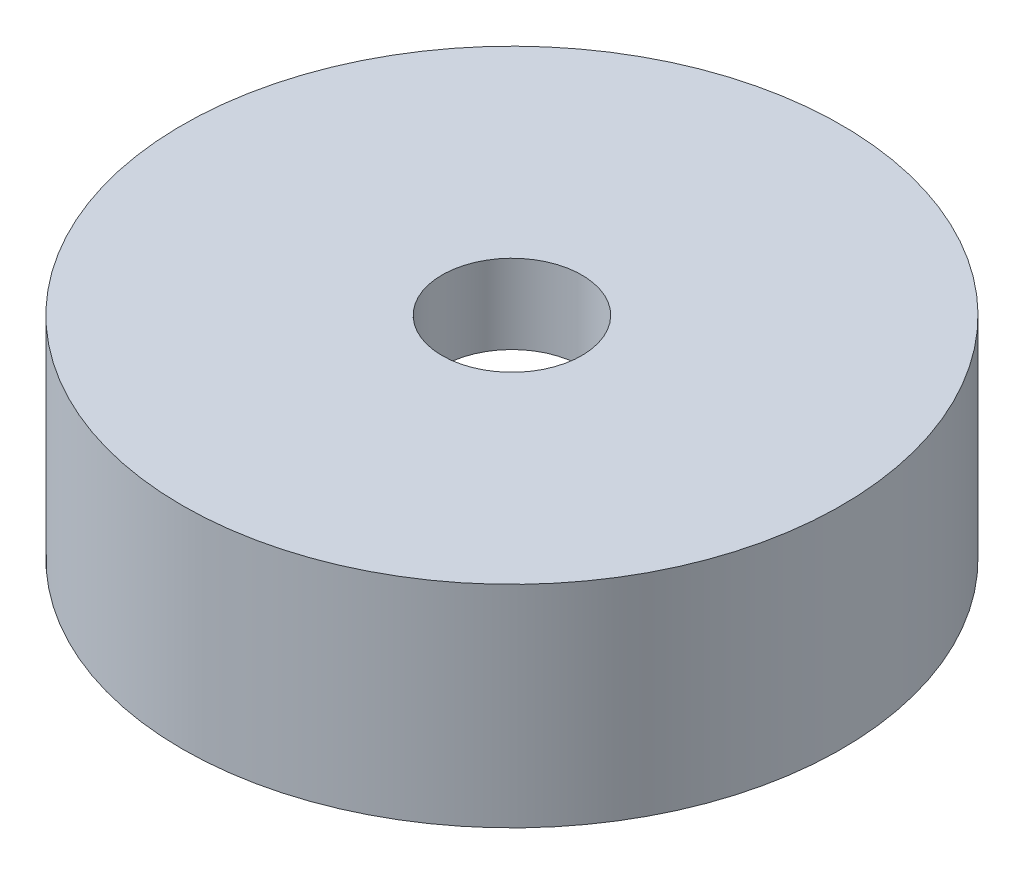
ISO-10303-21;
HEADER;
FILE_DESCRIPTION(('STEP AP214'),'2;1');
FILE_NAME('part.step','',(''),(''),'','','');
FILE_SCHEMA(('AUTOMOTIVE_DESIGN { 1 0 10303 214 1 1 1 1 }'));
ENDSEC;
DATA;
#1=APPLICATION_CONTEXT('core data for automotive mechanical design processes');
#2=APPLICATION_PROTOCOL_DEFINITION('international standard','automotive_design',2000,#1);
#3=PRODUCT_CONTEXT('',#1,'mechanical');
#4=PRODUCT('Part','Part','',(#3));
#5=PRODUCT_RELATED_PRODUCT_CATEGORY('part','',(#4));
#6=PRODUCT_DEFINITION_FORMATION('','',#4);
#7=PRODUCT_DEFINITION_CONTEXT('part definition',#1,'design');
#8=PRODUCT_DEFINITION('design','',#6,#7);
#9=PRODUCT_DEFINITION_SHAPE('','',#8);
#10=(LENGTH_UNIT() NAMED_UNIT(*) SI_UNIT(.MILLI.,.METRE.));
#11=(NAMED_UNIT(*) PLANE_ANGLE_UNIT() SI_UNIT($,.RADIAN.));
#12=(NAMED_UNIT(*) SI_UNIT($,.STERADIAN.) SOLID_ANGLE_UNIT());
#13=UNCERTAINTY_MEASURE_WITH_UNIT(LENGTH_MEASURE(1.E-05),#10,'distance_accuracy_value','');
#14=(GEOMETRIC_REPRESENTATION_CONTEXT(3) GLOBAL_UNCERTAINTY_ASSIGNED_CONTEXT((#13)) GLOBAL_UNIT_ASSIGNED_CONTEXT((#10,
#11,#12)) REPRESENTATION_CONTEXT('',''));
#15=CARTESIAN_POINT('',(0.,0.,0.));
#16=DIRECTION('',(0.,0.,1.));
#17=DIRECTION('',(1.,0.,0.));
#18=AXIS2_PLACEMENT_3D('',#15,#16,#17);
#19=CARTESIAN_POINT('',(0.,0.,0.));
#20=DIRECTION('',(0.,1.,0.));
#21=DIRECTION('',(0.,0.,1.));
#22=AXIS2_PLACEMENT_3D('',#19,#20,#21);
#23=PLANE('',#22);
#24=CARTESIAN_POINT('',(0.,0.,0.));
#25=DIRECTION('',(0.,1.,0.));
#26=DIRECTION('',(0.,0.,1.));
#27=AXIS2_PLACEMENT_3D('',#24,#25,#26);
#28=CIRCLE('',#27,12.5);
#29=CARTESIAN_POINT('',(0.,0.,12.5));
#30=VERTEX_POINT('',#29);
#31=EDGE_CURVE('E10',#30,#30,#28,.T.);
#32=ORIENTED_EDGE('',*,*,#31,.F.);
#33=EDGE_LOOP('',(#32));
#34=FACE_BOUND('',#33,.T.);
#35=CARTESIAN_POINT('',(0.,0.,0.));
#36=DIRECTION('',(0.,1.,0.));
#37=DIRECTION('',(0.,0.,1.));
#38=AXIS2_PLACEMENT_3D('',#35,#36,#37);
#39=CIRCLE('',#38,10.);
#40=CARTESIAN_POINT('',(0.,0.,10.));
#41=VERTEX_POINT('',#40);
#42=EDGE_CURVE('E44',#41,#41,#39,.T.);
#43=ORIENTED_EDGE('',*,*,#42,.T.);
#44=EDGE_LOOP('',(#43));
#45=FACE_BOUND('',#44,.T.);
#46=ADVANCED_FACE('F37',(#34,#45),#23,.F.);
#47=CARTESIAN_POINT('',(0.,5.,0.));
#48=DIRECTION('',(0.,-1.,0.));
#49=DIRECTION('',(0.,0.,-1.));
#50=AXIS2_PLACEMENT_3D('',#47,#48,#49);
#51=CYLINDRICAL_SURFACE('',#50,12.5);
#52=ORIENTED_EDGE('',*,*,#31,.T.);
#53=EDGE_LOOP('',(#52));
#54=FACE_BOUND('',#53,.T.);
#55=CARTESIAN_POINT('',(0.,8.,0.));
#56=DIRECTION('',(0.,1.,0.));
#57=DIRECTION('',(0.,0.,1.));
#58=AXIS2_PLACEMENT_3D('',#55,#56,#57);
#59=CIRCLE('',#58,12.5);
#60=CARTESIAN_POINT('',(0.,8.,12.5));
#61=VERTEX_POINT('',#60);
#62=EDGE_CURVE('E52',#61,#61,#59,.T.);
#63=ORIENTED_EDGE('',*,*,#62,.F.);
#64=EDGE_LOOP('',(#63));
#65=FACE_BOUND('',#64,.T.);
#66=ADVANCED_FACE('F39',(#54,#65),#51,.T.);
#67=CARTESIAN_POINT('',(0.,5.,0.));
#68=DIRECTION('',(0.,-1.,0.));
#69=DIRECTION('',(0.,0.,-1.));
#70=AXIS2_PLACEMENT_3D('',#67,#68,#69);
#71=CYLINDRICAL_SURFACE('',#70,10.);
#72=CARTESIAN_POINT('',(0.,5.,0.));
#73=DIRECTION('',(0.,1.,0.));
#74=DIRECTION('',(0.,0.,1.));
#75=AXIS2_PLACEMENT_3D('',#72,#73,#74);
#76=CIRCLE('',#75,10.);
#77=CARTESIAN_POINT('',(0.,5.,10.));
#78=VERTEX_POINT('',#77);
#79=EDGE_CURVE('E48',#78,#78,#76,.T.);
#80=ORIENTED_EDGE('',*,*,#79,.T.);
#81=EDGE_LOOP('',(#80));
#82=FACE_BOUND('',#81,.T.);
#83=ORIENTED_EDGE('',*,*,#42,.F.);
#84=EDGE_LOOP('',(#83));
#85=FACE_BOUND('',#84,.T.);
#86=ADVANCED_FACE('F77',(#82,#85),#71,.F.);
#87=CARTESIAN_POINT('',(0.,5.,0.));
#88=DIRECTION('',(0.,1.,0.));
#89=DIRECTION('',(0.,0.,1.));
#90=AXIS2_PLACEMENT_3D('',#87,#88,#89);
#91=PLANE('',#90);
#92=CARTESIAN_POINT('',(0.,5.,0.));
#93=DIRECTION('',(0.,1.,0.));
#94=DIRECTION('',(0.,0.,1.));
#95=AXIS2_PLACEMENT_3D('',#92,#93,#94);
#96=CIRCLE('',#95,2.65);
#97=CARTESIAN_POINT('',(0.,5.,2.65));
#98=VERTEX_POINT('',#97);
#99=EDGE_CURVE('E58',#98,#98,#96,.T.);
#100=ORIENTED_EDGE('',*,*,#99,.T.);
#101=EDGE_LOOP('',(#100));
#102=FACE_BOUND('',#101,.T.);
#103=ORIENTED_EDGE('',*,*,#79,.F.);
#104=EDGE_LOOP('',(#103));
#105=FACE_BOUND('',#104,.T.);
#106=ADVANCED_FACE('F69',(#102,#105),#91,.F.);
#107=CARTESIAN_POINT('',(0.,8.,0.));
#108=DIRECTION('',(0.,1.,0.));
#109=DIRECTION('',(0.,0.,1.));
#110=AXIS2_PLACEMENT_3D('',#107,#108,#109);
#111=PLANE('',#110);
#112=ORIENTED_EDGE('',*,*,#62,.T.);
#113=EDGE_LOOP('',(#112));
#114=FACE_BOUND('',#113,.T.);
#115=CARTESIAN_POINT('',(0.,8.,0.));
#116=DIRECTION('',(0.,1.,0.));
#117=DIRECTION('',(0.,0.,1.));
#118=AXIS2_PLACEMENT_3D('',#115,#116,#117);
#119=CIRCLE('',#118,2.65);
#120=CARTESIAN_POINT('',(0.,8.,2.65));
#121=VERTEX_POINT('',#120);
#122=EDGE_CURVE('E57',#121,#121,#119,.T.);
#123=ORIENTED_EDGE('',*,*,#122,.F.);
#124=EDGE_LOOP('',(#123));
#125=FACE_BOUND('',#124,.T.);
#126=ADVANCED_FACE('F67',(#114,#125),#111,.T.);
#127=CARTESIAN_POINT('',(0.,8.,0.));
#128=DIRECTION('',(0.,-1.,0.));
#129=DIRECTION('',(0.,0.,-1.));
#130=AXIS2_PLACEMENT_3D('',#127,#128,#129);
#131=CYLINDRICAL_SURFACE('',#130,2.65);
#132=ORIENTED_EDGE('',*,*,#122,.T.);
#133=EDGE_LOOP('',(#132));
#134=FACE_BOUND('',#133,.T.);
#135=ORIENTED_EDGE('',*,*,#99,.F.);
#136=EDGE_LOOP('',(#135));
#137=FACE_BOUND('',#136,.T.);
#138=ADVANCED_FACE('F64',(#134,#137),#131,.F.);
#139=CLOSED_SHELL('',(#46,#66,#86,#106,#126,#138));
#140=MANIFOLD_SOLID_BREP('B2',#139);
#141=ADVANCED_BREP_SHAPE_REPRESENTATION('',(#18,#140),#14);
#142=SHAPE_DEFINITION_REPRESENTATION(#9,#141);
ENDSEC;
END-ISO-10303-21;
